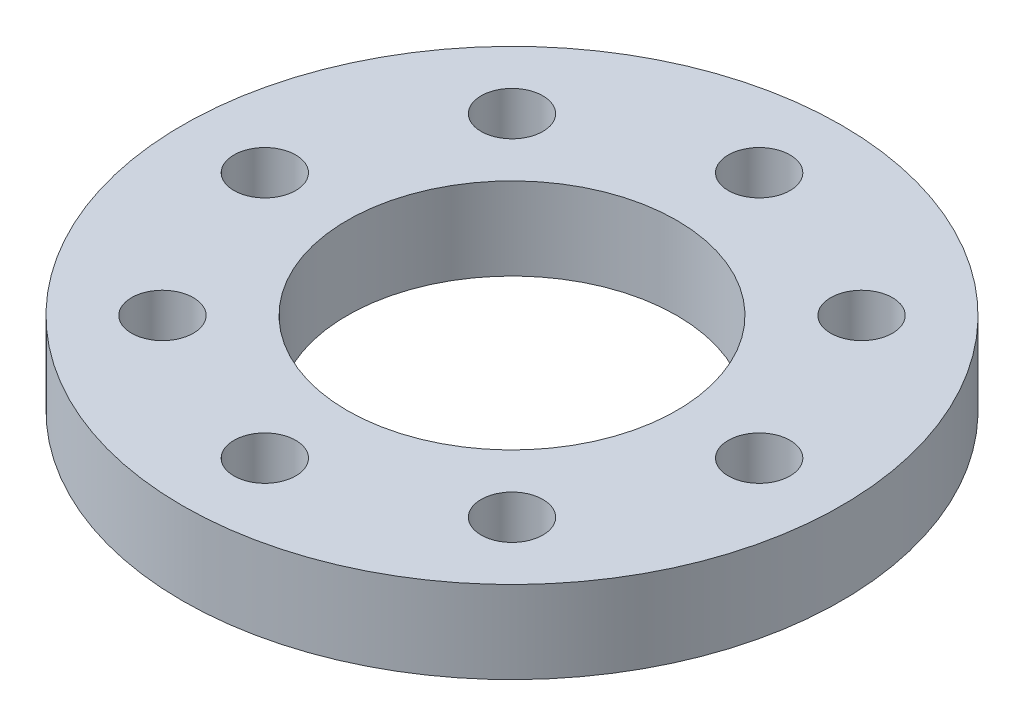
ISO-10303-21;
HEADER;
FILE_DESCRIPTION(('STEP AP214'),'2;1');
FILE_NAME('part.step','',(''),(''),'','','');
FILE_SCHEMA(('AUTOMOTIVE_DESIGN { 1 0 10303 214 1 1 1 1 }'));
ENDSEC;
DATA;
#1=APPLICATION_CONTEXT('core data for automotive mechanical design processes');
#2=APPLICATION_PROTOCOL_DEFINITION('international standard','automotive_design',2000,#1);
#3=PRODUCT_CONTEXT('',#1,'mechanical');
#4=PRODUCT('Part','Part','',(#3));
#5=PRODUCT_RELATED_PRODUCT_CATEGORY('part','',(#4));
#6=PRODUCT_DEFINITION_FORMATION('','',#4);
#7=PRODUCT_DEFINITION_CONTEXT('part definition',#1,'design');
#8=PRODUCT_DEFINITION('design','',#6,#7);
#9=PRODUCT_DEFINITION_SHAPE('','',#8);
#10=(LENGTH_UNIT() NAMED_UNIT(*) SI_UNIT(.MILLI.,.METRE.));
#11=(NAMED_UNIT(*) PLANE_ANGLE_UNIT() SI_UNIT($,.RADIAN.));
#12=(NAMED_UNIT(*) SI_UNIT($,.STERADIAN.) SOLID_ANGLE_UNIT());
#13=UNCERTAINTY_MEASURE_WITH_UNIT(LENGTH_MEASURE(1.E-05),#10,'distance_accuracy_value','');
#14=(GEOMETRIC_REPRESENTATION_CONTEXT(3) GLOBAL_UNCERTAINTY_ASSIGNED_CONTEXT((#13)) GLOBAL_UNIT_ASSIGNED_CONTEXT((#10,
#11,#12)) REPRESENTATION_CONTEXT('',''));
#15=CARTESIAN_POINT('',(0.,0.,0.));
#16=DIRECTION('',(0.,0.,1.));
#17=DIRECTION('',(1.,0.,0.));
#18=AXIS2_PLACEMENT_3D('',#15,#16,#17);
#19=CARTESIAN_POINT('',(0.,50.8,0.));
#20=DIRECTION('',(0.,-1.,0.));
#21=DIRECTION('',(0.,0.,-1.));
#22=AXIS2_PLACEMENT_3D('',#19,#20,#21);
#23=CYLINDRICAL_SURFACE('',#22,101.6);
#24=CARTESIAN_POINT('',(0.,50.8,0.));
#25=DIRECTION('',(0.,1.,0.));
#26=DIRECTION('',(0.,0.,1.));
#27=AXIS2_PLACEMENT_3D('',#24,#25,#26);
#28=CIRCLE('',#27,101.6);
#29=CARTESIAN_POINT('',(0.,50.8,101.6));
#30=VERTEX_POINT('',#29);
#31=EDGE_CURVE('E47',#30,#30,#28,.T.);
#32=ORIENTED_EDGE('',*,*,#31,.T.);
#33=EDGE_LOOP('',(#32));
#34=FACE_BOUND('',#33,.T.);
#35=CARTESIAN_POINT('',(0.,0.,0.));
#36=DIRECTION('',(0.,1.,0.));
#37=DIRECTION('',(0.,0.,1.));
#38=AXIS2_PLACEMENT_3D('',#35,#36,#37);
#39=CIRCLE('',#38,101.6);
#40=CARTESIAN_POINT('',(0.,0.,101.6));
#41=VERTEX_POINT('',#40);
#42=EDGE_CURVE('E79',#41,#41,#39,.T.);
#43=ORIENTED_EDGE('',*,*,#42,.F.);
#44=EDGE_LOOP('',(#43));
#45=FACE_BOUND('',#44,.T.);
#46=ADVANCED_FACE('F39',(#34,#45),#23,.F.);
#47=CARTESIAN_POINT('',(0.,50.8,-152.4));
#48=DIRECTION('',(0.,-1.,0.));
#49=DIRECTION('',(0.,0.,-1.));
#50=AXIS2_PLACEMENT_3D('',#47,#48,#49);
#51=CYLINDRICAL_SURFACE('',#50,19.05);
#52=CARTESIAN_POINT('',(0.,50.8,-152.4));
#53=DIRECTION('',(0.,1.,0.));
#54=DIRECTION('',(0.,0.,1.));
#55=AXIS2_PLACEMENT_3D('',#52,#53,#54);
#56=CIRCLE('',#55,19.05);
#57=CARTESIAN_POINT('',(0.,50.8,-133.35));
#58=VERTEX_POINT('',#57);
#59=EDGE_CURVE('E52',#58,#58,#56,.T.);
#60=ORIENTED_EDGE('',*,*,#59,.T.);
#61=EDGE_LOOP('',(#60));
#62=FACE_BOUND('',#61,.T.);
#63=CARTESIAN_POINT('',(0.,0.,-152.4));
#64=DIRECTION('',(0.,1.,0.));
#65=DIRECTION('',(0.,0.,1.));
#66=AXIS2_PLACEMENT_3D('',#63,#64,#65);
#67=CIRCLE('',#66,19.05);
#68=CARTESIAN_POINT('',(0.,0.,-133.35));
#69=VERTEX_POINT('',#68);
#70=EDGE_CURVE('E77',#69,#69,#67,.T.);
#71=ORIENTED_EDGE('',*,*,#70,.F.);
#72=EDGE_LOOP('',(#71));
#73=FACE_BOUND('',#72,.T.);
#74=ADVANCED_FACE('F112',(#62,#73),#51,.F.);
#75=CARTESIAN_POINT('',(107.76307345283,50.8,-107.76307345283));
#76=DIRECTION('',(0.,-1.,0.));
#77=DIRECTION('',(0.,0.,-1.));
#78=AXIS2_PLACEMENT_3D('',#75,#76,#77);
#79=CYLINDRICAL_SURFACE('',#78,19.05);
#80=CARTESIAN_POINT('',(107.76307345283,50.8,-107.76307345283));
#81=DIRECTION('',(0.,1.,0.));
#82=DIRECTION('',(0.,0.,1.));
#83=AXIS2_PLACEMENT_3D('',#80,#81,#82);
#84=CIRCLE('',#83,19.05);
#85=CARTESIAN_POINT('',(107.76307345283,50.8,-88.7130734528297));
#86=VERTEX_POINT('',#85);
#87=EDGE_CURVE('E107',#86,#86,#84,.T.);
#88=ORIENTED_EDGE('',*,*,#87,.T.);
#89=EDGE_LOOP('',(#88));
#90=FACE_BOUND('',#89,.T.);
#91=CARTESIAN_POINT('',(107.76307345283,0.,-107.76307345283));
#92=DIRECTION('',(0.,1.,0.));
#93=DIRECTION('',(0.,0.,1.));
#94=AXIS2_PLACEMENT_3D('',#91,#92,#93);
#95=CIRCLE('',#94,19.05);
#96=CARTESIAN_POINT('',(107.76307345283,0.,-88.7130734528297));
#97=VERTEX_POINT('',#96);
#98=EDGE_CURVE('E74',#97,#97,#95,.T.);
#99=ORIENTED_EDGE('',*,*,#98,.F.);
#100=EDGE_LOOP('',(#99));
#101=FACE_BOUND('',#100,.T.);
#102=ADVANCED_FACE('F130',(#90,#101),#79,.F.);
#103=CARTESIAN_POINT('',(152.4,50.8,5.32101756039693E-13));
#104=DIRECTION('',(0.,-1.,0.));
#105=DIRECTION('',(0.,0.,-1.));
#106=AXIS2_PLACEMENT_3D('',#103,#104,#105);
#107=CYLINDRICAL_SURFACE('',#106,19.05);
#108=CARTESIAN_POINT('',(152.4,50.8,5.32101756039693E-13));
#109=DIRECTION('',(0.,1.,0.));
#110=DIRECTION('',(0.,0.,1.));
#111=AXIS2_PLACEMENT_3D('',#108,#109,#110);
#112=CIRCLE('',#111,19.05);
#113=CARTESIAN_POINT('',(152.4,50.8,19.0500000000005));
#114=VERTEX_POINT('',#113);
#115=EDGE_CURVE('E104',#114,#114,#112,.T.);
#116=ORIENTED_EDGE('',*,*,#115,.T.);
#117=EDGE_LOOP('',(#116));
#118=FACE_BOUND('',#117,.T.);
#119=CARTESIAN_POINT('',(152.4,0.,5.32101756039693E-13));
#120=DIRECTION('',(0.,1.,0.));
#121=DIRECTION('',(0.,0.,1.));
#122=AXIS2_PLACEMENT_3D('',#119,#120,#121);
#123=CIRCLE('',#122,19.05);
#124=CARTESIAN_POINT('',(152.4,0.,19.0500000000005));
#125=VERTEX_POINT('',#124);
#126=EDGE_CURVE('E71',#125,#125,#123,.T.);
#127=ORIENTED_EDGE('',*,*,#126,.F.);
#128=EDGE_LOOP('',(#127));
#129=FACE_BOUND('',#128,.T.);
#130=ADVANCED_FACE('F137',(#118,#129),#107,.F.);
#131=CARTESIAN_POINT('',(107.763073452829,50.8,107.76307345283));
#132=DIRECTION('',(0.,-1.,0.));
#133=DIRECTION('',(0.,0.,-1.));
#134=AXIS2_PLACEMENT_3D('',#131,#132,#133);
#135=CYLINDRICAL_SURFACE('',#134,19.05);
#136=CARTESIAN_POINT('',(107.763073452829,50.8,107.76307345283));
#137=DIRECTION('',(0.,1.,0.));
#138=DIRECTION('',(0.,0.,1.));
#139=AXIS2_PLACEMENT_3D('',#136,#137,#138);
#140=CIRCLE('',#139,19.05);
#141=CARTESIAN_POINT('',(107.763073452829,50.8,126.81307345283));
#142=VERTEX_POINT('',#141);
#143=EDGE_CURVE('E101',#142,#142,#140,.T.);
#144=ORIENTED_EDGE('',*,*,#143,.T.);
#145=EDGE_LOOP('',(#144));
#146=FACE_BOUND('',#145,.T.);
#147=CARTESIAN_POINT('',(107.763073452829,0.,107.76307345283));
#148=DIRECTION('',(0.,1.,0.));
#149=DIRECTION('',(0.,0.,1.));
#150=AXIS2_PLACEMENT_3D('',#147,#148,#149);
#151=CIRCLE('',#150,19.05);
#152=CARTESIAN_POINT('',(107.763073452829,0.,126.81307345283));
#153=VERTEX_POINT('',#152);
#154=EDGE_CURVE('E68',#153,#153,#151,.T.);
#155=ORIENTED_EDGE('',*,*,#154,.F.);
#156=EDGE_LOOP('',(#155));
#157=FACE_BOUND('',#156,.T.);
#158=ADVANCED_FACE('F141',(#146,#157),#135,.F.);
#159=CARTESIAN_POINT('',(-1.06420351207939E-12,50.8,152.4));
#160=DIRECTION('',(0.,-1.,0.));
#161=DIRECTION('',(0.,0.,-1.));
#162=AXIS2_PLACEMENT_3D('',#159,#160,#161);
#163=CYLINDRICAL_SURFACE('',#162,19.05);
#164=CARTESIAN_POINT('',(-1.06420351207939E-12,50.8,152.4));
#165=DIRECTION('',(0.,1.,0.));
#166=DIRECTION('',(0.,0.,1.));
#167=AXIS2_PLACEMENT_3D('',#164,#165,#166);
#168=CIRCLE('',#167,19.05);
#169=CARTESIAN_POINT('',(-1.06420351207939E-12,50.8,171.45));
#170=VERTEX_POINT('',#169);
#171=EDGE_CURVE('E98',#170,#170,#168,.T.);
#172=ORIENTED_EDGE('',*,*,#171,.T.);
#173=EDGE_LOOP('',(#172));
#174=FACE_BOUND('',#173,.T.);
#175=CARTESIAN_POINT('',(-1.06420351207939E-12,0.,152.4));
#176=DIRECTION('',(0.,1.,0.));
#177=DIRECTION('',(0.,0.,1.));
#178=AXIS2_PLACEMENT_3D('',#175,#176,#177);
#179=CIRCLE('',#178,19.05);
#180=CARTESIAN_POINT('',(-1.06420351207939E-12,0.,171.45));
#181=VERTEX_POINT('',#180);
#182=EDGE_CURVE('E65',#181,#181,#179,.T.);
#183=ORIENTED_EDGE('',*,*,#182,.F.);
#184=EDGE_LOOP('',(#183));
#185=FACE_BOUND('',#184,.T.);
#186=ADVANCED_FACE('F145',(#174,#185),#163,.F.);
#187=CARTESIAN_POINT('',(-107.763073452831,50.8,107.763073452829));
#188=DIRECTION('',(0.,-1.,0.));
#189=DIRECTION('',(0.,0.,-1.));
#190=AXIS2_PLACEMENT_3D('',#187,#188,#189);
#191=CYLINDRICAL_SURFACE('',#190,19.05);
#192=CARTESIAN_POINT('',(-107.763073452831,50.8,107.763073452829));
#193=DIRECTION('',(0.,1.,0.));
#194=DIRECTION('',(0.,0.,1.));
#195=AXIS2_PLACEMENT_3D('',#192,#193,#194);
#196=CIRCLE('',#195,19.05);
#197=CARTESIAN_POINT('',(-107.763073452831,50.8,126.813073452829));
#198=VERTEX_POINT('',#197);
#199=EDGE_CURVE('E93',#198,#198,#196,.T.);
#200=ORIENTED_EDGE('',*,*,#199,.T.);
#201=EDGE_LOOP('',(#200));
#202=FACE_BOUND('',#201,.T.);
#203=CARTESIAN_POINT('',(-107.763073452831,0.,107.763073452829));
#204=DIRECTION('',(0.,1.,0.));
#205=DIRECTION('',(0.,0.,1.));
#206=AXIS2_PLACEMENT_3D('',#203,#204,#205);
#207=CIRCLE('',#206,19.05);
#208=CARTESIAN_POINT('',(-107.763073452831,0.,126.813073452829));
#209=VERTEX_POINT('',#208);
#210=EDGE_CURVE('E62',#209,#209,#207,.T.);
#211=ORIENTED_EDGE('',*,*,#210,.F.);
#212=EDGE_LOOP('',(#211));
#213=FACE_BOUND('',#212,.T.);
#214=ADVANCED_FACE('F149',(#202,#213),#191,.F.);
#215=CARTESIAN_POINT('',(-152.4,50.8,-1.59630526811908E-12));
#216=DIRECTION('',(0.,-1.,0.));
#217=DIRECTION('',(0.,0.,-1.));
#218=AXIS2_PLACEMENT_3D('',#215,#216,#217);
#219=CYLINDRICAL_SURFACE('',#218,19.05);
#220=CARTESIAN_POINT('',(-152.4,50.8,-1.59630526811908E-12));
#221=DIRECTION('',(0.,1.,0.));
#222=DIRECTION('',(0.,0.,1.));
#223=AXIS2_PLACEMENT_3D('',#220,#221,#222);
#224=CIRCLE('',#223,19.05);
#225=CARTESIAN_POINT('',(-152.4,50.8,19.0499999999984));
#226=VERTEX_POINT('',#225);
#227=EDGE_CURVE('E88',#226,#226,#224,.T.);
#228=ORIENTED_EDGE('',*,*,#227,.T.);
#229=EDGE_LOOP('',(#228));
#230=FACE_BOUND('',#229,.T.);
#231=CARTESIAN_POINT('',(-152.4,0.,-1.59630526811908E-12));
#232=DIRECTION('',(0.,1.,0.));
#233=DIRECTION('',(0.,0.,1.));
#234=AXIS2_PLACEMENT_3D('',#231,#232,#233);
#235=CIRCLE('',#234,19.05);
#236=CARTESIAN_POINT('',(-152.4,0.,19.0499999999984));
#237=VERTEX_POINT('',#236);
#238=EDGE_CURVE('E59',#237,#237,#235,.T.);
#239=ORIENTED_EDGE('',*,*,#238,.F.);
#240=EDGE_LOOP('',(#239));
#241=FACE_BOUND('',#240,.T.);
#242=ADVANCED_FACE('F152',(#230,#241),#219,.F.);
#243=CARTESIAN_POINT('',(-107.763073452829,50.8,-107.763073452831));
#244=DIRECTION('',(0.,-1.,0.));
#245=DIRECTION('',(0.,0.,-1.));
#246=AXIS2_PLACEMENT_3D('',#243,#244,#245);
#247=CYLINDRICAL_SURFACE('',#246,19.05);
#248=CARTESIAN_POINT('',(-107.763073452829,50.8,-107.763073452831));
#249=DIRECTION('',(0.,1.,0.));
#250=DIRECTION('',(0.,0.,1.));
#251=AXIS2_PLACEMENT_3D('',#248,#249,#250);
#252=CIRCLE('',#251,19.05);
#253=CARTESIAN_POINT('',(-107.763073452829,50.8,-88.7130734528312));
#254=VERTEX_POINT('',#253);
#255=EDGE_CURVE('E84',#254,#254,#252,.T.);
#256=ORIENTED_EDGE('',*,*,#255,.T.);
#257=EDGE_LOOP('',(#256));
#258=FACE_BOUND('',#257,.T.);
#259=CARTESIAN_POINT('',(-107.763073452829,0.,-107.763073452831));
#260=DIRECTION('',(0.,1.,0.));
#261=DIRECTION('',(0.,0.,1.));
#262=AXIS2_PLACEMENT_3D('',#259,#260,#261);
#263=CIRCLE('',#262,19.05);
#264=CARTESIAN_POINT('',(-107.763073452829,0.,-88.7130734528312));
#265=VERTEX_POINT('',#264);
#266=EDGE_CURVE('E56',#265,#265,#263,.T.);
#267=ORIENTED_EDGE('',*,*,#266,.F.);
#268=EDGE_LOOP('',(#267));
#269=FACE_BOUND('',#268,.T.);
#270=ADVANCED_FACE('F41',(#258,#269),#247,.F.);
#271=CARTESIAN_POINT('',(0.,50.8,0.));
#272=DIRECTION('',(0.,-1.,0.));
#273=DIRECTION('',(0.,0.,-1.));
#274=AXIS2_PLACEMENT_3D('',#271,#272,#273);
#275=CYLINDRICAL_SURFACE('',#274,203.2);
#276=CARTESIAN_POINT('',(0.,50.8,0.));
#277=DIRECTION('',(0.,1.,0.));
#278=DIRECTION('',(0.,0.,1.));
#279=AXIS2_PLACEMENT_3D('',#276,#277,#278);
#280=CIRCLE('',#279,203.2);
#281=CARTESIAN_POINT('',(0.,50.8,203.2));
#282=VERTEX_POINT('',#281);
#283=EDGE_CURVE('E10',#282,#282,#280,.T.);
#284=ORIENTED_EDGE('',*,*,#283,.F.);
#285=EDGE_LOOP('',(#284));
#286=FACE_BOUND('',#285,.T.);
#287=CARTESIAN_POINT('',(0.,0.,0.));
#288=DIRECTION('',(0.,1.,0.));
#289=DIRECTION('',(0.,0.,1.));
#290=AXIS2_PLACEMENT_3D('',#287,#288,#289);
#291=CIRCLE('',#290,203.2);
#292=CARTESIAN_POINT('',(0.,0.,203.2));
#293=VERTEX_POINT('',#292);
#294=EDGE_CURVE('E43',#293,#293,#291,.T.);
#295=ORIENTED_EDGE('',*,*,#294,.T.);
#296=EDGE_LOOP('',(#295));
#297=FACE_BOUND('',#296,.T.);
#298=ADVANCED_FACE('F119',(#286,#297),#275,.T.);
#299=CARTESIAN_POINT('',(0.,50.8,0.));
#300=DIRECTION('',(0.,1.,0.));
#301=DIRECTION('',(0.,0.,1.));
#302=AXIS2_PLACEMENT_3D('',#299,#300,#301);
#303=PLANE('',#302);
#304=ORIENTED_EDGE('',*,*,#255,.F.);
#305=EDGE_LOOP('',(#304));
#306=FACE_BOUND('',#305,.T.);
#307=ORIENTED_EDGE('',*,*,#227,.F.);
#308=EDGE_LOOP('',(#307));
#309=FACE_BOUND('',#308,.T.);
#310=ORIENTED_EDGE('',*,*,#199,.F.);
#311=EDGE_LOOP('',(#310));
#312=FACE_BOUND('',#311,.T.);
#313=ORIENTED_EDGE('',*,*,#171,.F.);
#314=EDGE_LOOP('',(#313));
#315=FACE_BOUND('',#314,.T.);
#316=ORIENTED_EDGE('',*,*,#143,.F.);
#317=EDGE_LOOP('',(#316));
#318=FACE_BOUND('',#317,.T.);
#319=ORIENTED_EDGE('',*,*,#115,.F.);
#320=EDGE_LOOP('',(#319));
#321=FACE_BOUND('',#320,.T.);
#322=ORIENTED_EDGE('',*,*,#87,.F.);
#323=EDGE_LOOP('',(#322));
#324=FACE_BOUND('',#323,.T.);
#325=ORIENTED_EDGE('',*,*,#59,.F.);
#326=EDGE_LOOP('',(#325));
#327=FACE_BOUND('',#326,.T.);
#328=ORIENTED_EDGE('',*,*,#31,.F.);
#329=EDGE_LOOP('',(#328));
#330=FACE_BOUND('',#329,.T.);
#331=ORIENTED_EDGE('',*,*,#283,.T.);
#332=EDGE_LOOP('',(#331));
#333=FACE_BOUND('',#332,.T.);
#334=ADVANCED_FACE('F115',(#306,#309,#312,#315,#318,#321,#324,#327,#330,#333),#303,.T.);
#335=CARTESIAN_POINT('',(0.,0.,0.));
#336=DIRECTION('',(0.,1.,0.));
#337=DIRECTION('',(0.,0.,1.));
#338=AXIS2_PLACEMENT_3D('',#335,#336,#337);
#339=PLANE('',#338);
#340=ORIENTED_EDGE('',*,*,#266,.T.);
#341=EDGE_LOOP('',(#340));
#342=FACE_BOUND('',#341,.T.);
#343=ORIENTED_EDGE('',*,*,#238,.T.);
#344=EDGE_LOOP('',(#343));
#345=FACE_BOUND('',#344,.T.);
#346=ORIENTED_EDGE('',*,*,#210,.T.);
#347=EDGE_LOOP('',(#346));
#348=FACE_BOUND('',#347,.T.);
#349=ORIENTED_EDGE('',*,*,#182,.T.);
#350=EDGE_LOOP('',(#349));
#351=FACE_BOUND('',#350,.T.);
#352=ORIENTED_EDGE('',*,*,#154,.T.);
#353=EDGE_LOOP('',(#352));
#354=FACE_BOUND('',#353,.T.);
#355=ORIENTED_EDGE('',*,*,#126,.T.);
#356=EDGE_LOOP('',(#355));
#357=FACE_BOUND('',#356,.T.);
#358=ORIENTED_EDGE('',*,*,#98,.T.);
#359=EDGE_LOOP('',(#358));
#360=FACE_BOUND('',#359,.T.);
#361=ORIENTED_EDGE('',*,*,#70,.T.);
#362=EDGE_LOOP('',(#361));
#363=FACE_BOUND('',#362,.T.);
#364=ORIENTED_EDGE('',*,*,#42,.T.);
#365=EDGE_LOOP('',(#364));
#366=FACE_BOUND('',#365,.T.);
#367=ORIENTED_EDGE('',*,*,#294,.F.);
#368=EDGE_LOOP('',(#367));
#369=FACE_BOUND('',#368,.T.);
#370=ADVANCED_FACE('F118',(#342,#345,#348,#351,#354,#357,#360,#363,#366,#369),#339,.F.);
#371=CLOSED_SHELL('',(#46,#74,#102,#130,#158,#186,#214,#242,#270,#298,#334,#370));
#372=MANIFOLD_SOLID_BREP('B2',#371);
#373=ADVANCED_BREP_SHAPE_REPRESENTATION('',(#18,#372),#14);
#374=SHAPE_DEFINITION_REPRESENTATION(#9,#373);
ENDSEC;
END-ISO-10303-21;
